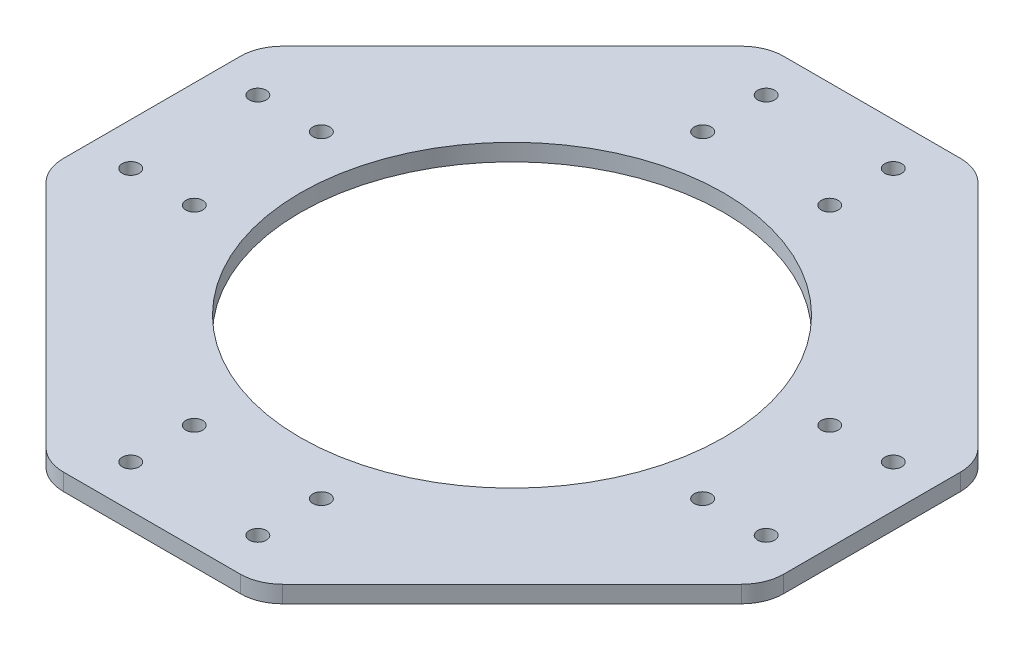
ISO-10303-21;
HEADER;
FILE_DESCRIPTION(('STEP AP214'),'2;1');
FILE_NAME('part.step','',(''),(''),'','','');
FILE_SCHEMA(('AUTOMOTIVE_DESIGN { 1 0 10303 214 1 1 1 1 }'));
ENDSEC;
DATA;
#1=APPLICATION_CONTEXT('core data for automotive mechanical design processes');
#2=APPLICATION_PROTOCOL_DEFINITION('international standard','automotive_design',2000,#1);
#3=PRODUCT_CONTEXT('',#1,'mechanical');
#4=PRODUCT('Part','Part','',(#3));
#5=PRODUCT_RELATED_PRODUCT_CATEGORY('part','',(#4));
#6=PRODUCT_DEFINITION_FORMATION('','',#4);
#7=PRODUCT_DEFINITION_CONTEXT('part definition',#1,'design');
#8=PRODUCT_DEFINITION('design','',#6,#7);
#9=PRODUCT_DEFINITION_SHAPE('','',#8);
#10=(LENGTH_UNIT() NAMED_UNIT(*) SI_UNIT(.MILLI.,.METRE.));
#11=(NAMED_UNIT(*) PLANE_ANGLE_UNIT() SI_UNIT($,.RADIAN.));
#12=(NAMED_UNIT(*) SI_UNIT($,.STERADIAN.) SOLID_ANGLE_UNIT());
#13=UNCERTAINTY_MEASURE_WITH_UNIT(LENGTH_MEASURE(1.E-05),#10,'distance_accuracy_value','');
#14=(GEOMETRIC_REPRESENTATION_CONTEXT(3) GLOBAL_UNCERTAINTY_ASSIGNED_CONTEXT((#13)) GLOBAL_UNIT_ASSIGNED_CONTEXT((#10,
#11,#12)) REPRESENTATION_CONTEXT('',''));
#15=CARTESIAN_POINT('',(0.,0.,0.));
#16=DIRECTION('',(0.,0.,1.));
#17=DIRECTION('',(1.,0.,0.));
#18=AXIS2_PLACEMENT_3D('',#15,#16,#17);
#19=CARTESIAN_POINT('',(0.,4.,85.0000000000001));
#20=DIRECTION('',(0.,0.,-1.));
#21=DIRECTION('',(-1.,0.,0.));
#22=AXIS2_PLACEMENT_3D('',#19,#20,#21);
#23=PLANE('',#22);
#24=DIRECTION('',(1.,0.,0.));
#25=VECTOR('',#24,1.);
#26=CARTESIAN_POINT('',(0.,0.,85.0000000000001));
#27=LINE('',#26,#25);
#28=CARTESIAN_POINT('',(-20.8578643762685,0.,85.0000000000001));
#29=VERTEX_POINT('',#28);
#30=CARTESIAN_POINT('',(20.8578643762685,0.,85.0000000000001));
#31=VERTEX_POINT('',#30);
#32=EDGE_CURVE('E165',#29,#31,#27,.T.);
#33=ORIENTED_EDGE('',*,*,#32,.T.);
#34=DIRECTION('',(0.,-1.,0.));
#35=VECTOR('',#34,1.);
#36=CARTESIAN_POINT('',(20.8578643762685,4.,85.0000000000001));
#37=LINE('',#36,#35);
#38=CARTESIAN_POINT('',(20.8578643762685,4.,85.0000000000001));
#39=VERTEX_POINT('',#38);
#40=EDGE_CURVE('E11',#31,#39,#37,.F.);
#41=ORIENTED_EDGE('',*,*,#40,.T.);
#42=DIRECTION('',(1.,0.,0.));
#43=VECTOR('',#42,1.);
#44=CARTESIAN_POINT('',(0.,4.,85.0000000000001));
#45=LINE('',#44,#43);
#46=CARTESIAN_POINT('',(-20.8578643762685,4.,85.0000000000001));
#47=VERTEX_POINT('',#46);
#48=EDGE_CURVE('E253',#47,#39,#45,.T.);
#49=ORIENTED_EDGE('',*,*,#48,.F.);
#50=DIRECTION('',(0.,-1.,0.));
#51=VECTOR('',#50,1.);
#52=CARTESIAN_POINT('',(-20.8578643762685,0.,85.0000000000001));
#53=LINE('',#52,#51);
#54=EDGE_CURVE('E49',#47,#29,#53,.T.);
#55=ORIENTED_EDGE('',*,*,#54,.T.);
#56=EDGE_LOOP('',(#33,#41,#49,#55));
#57=FACE_BOUND('',#56,.T.);
#58=ADVANCED_FACE('F45',(#57),#23,.F.);
#59=CARTESIAN_POINT('',(54.9999999999997,4.,55.0000000000001));
#60=DIRECTION('',(-0.707106781186544,0.,-0.707106781186551));
#61=DIRECTION('',(-0.707106781186551,0.,0.707106781186544));
#62=AXIS2_PLACEMENT_3D('',#59,#60,#61);
#63=PLANE('',#62);
#64=DIRECTION('',(0.707106781186551,0.,-0.707106781186544));
#65=VECTOR('',#64,1.);
#66=CARTESIAN_POINT('',(54.9999999999997,0.,55.0000000000001));
#67=LINE('',#66,#65);
#68=CARTESIAN_POINT('',(27.928932188134,0.,82.0710678118656));
#69=VERTEX_POINT('',#68);
#70=CARTESIAN_POINT('',(82.0710678118655,0.,27.9289321881345));
#71=VERTEX_POINT('',#70);
#72=EDGE_CURVE('E330',#69,#71,#67,.T.);
#73=ORIENTED_EDGE('',*,*,#72,.T.);
#74=DIRECTION('',(0.,-1.,0.));
#75=VECTOR('',#74,1.);
#76=CARTESIAN_POINT('',(82.0710678118655,4.,27.9289321881345));
#77=LINE('',#76,#75);
#78=CARTESIAN_POINT('',(82.0710678118655,4.,27.9289321881345));
#79=VERTEX_POINT('',#78);
#80=EDGE_CURVE('E246',#71,#79,#77,.F.);
#81=ORIENTED_EDGE('',*,*,#80,.T.);
#82=DIRECTION('',(0.707106781186551,0.,-0.707106781186544));
#83=VECTOR('',#82,1.);
#84=CARTESIAN_POINT('',(54.9999999999997,4.,55.0000000000001));
#85=LINE('',#84,#83);
#86=CARTESIAN_POINT('',(27.928932188134,4.,82.0710678118656));
#87=VERTEX_POINT('',#86);
#88=EDGE_CURVE('E251',#87,#79,#85,.T.);
#89=ORIENTED_EDGE('',*,*,#88,.F.);
#90=DIRECTION('',(0.,-1.,0.));
#91=VECTOR('',#90,1.);
#92=CARTESIAN_POINT('',(27.928932188134,4.,82.0710678118656));
#93=LINE('',#92,#91);
#94=EDGE_CURVE('E245',#87,#69,#93,.T.);
#95=ORIENTED_EDGE('',*,*,#94,.T.);
#96=EDGE_LOOP('',(#73,#81,#89,#95));
#97=FACE_BOUND('',#96,.T.);
#98=ADVANCED_FACE('F419',(#97),#63,.F.);
#99=CARTESIAN_POINT('',(85.0000000000001,4.,0.));
#100=DIRECTION('',(1.,0.,0.));
#101=DIRECTION('',(0.,0.,-1.));
#102=AXIS2_PLACEMENT_3D('',#99,#100,#101);
#103=PLANE('',#102);
#104=DIRECTION('',(0.,0.,1.));
#105=VECTOR('',#104,1.);
#106=CARTESIAN_POINT('',(85.0000000000001,0.,0.));
#107=LINE('',#106,#105);
#108=CARTESIAN_POINT('',(85.0000000000001,0.,-20.8578643762691));
#109=VERTEX_POINT('',#108);
#110=CARTESIAN_POINT('',(85.0000000000001,0.,20.857864376269));
#111=VERTEX_POINT('',#110);
#112=EDGE_CURVE('E329',#109,#111,#107,.T.);
#113=ORIENTED_EDGE('',*,*,#112,.F.);
#114=DIRECTION('',(0.,-1.,0.));
#115=VECTOR('',#114,1.);
#116=CARTESIAN_POINT('',(85.0000000000001,4.,-20.8578643762691));
#117=LINE('',#116,#115);
#118=CARTESIAN_POINT('',(85.0000000000001,4.,-20.8578643762691));
#119=VERTEX_POINT('',#118);
#120=EDGE_CURVE('E242',#109,#119,#117,.F.);
#121=ORIENTED_EDGE('',*,*,#120,.T.);
#122=DIRECTION('',(0.,0.,1.));
#123=VECTOR('',#122,1.);
#124=CARTESIAN_POINT('',(85.0000000000001,4.,0.));
#125=LINE('',#124,#123);
#126=CARTESIAN_POINT('',(85.0000000000001,4.,20.857864376269));
#127=VERTEX_POINT('',#126);
#128=EDGE_CURVE('E260',#119,#127,#125,.T.);
#129=ORIENTED_EDGE('',*,*,#128,.T.);
#130=DIRECTION('',(0.,-1.,0.));
#131=VECTOR('',#130,1.);
#132=CARTESIAN_POINT('',(85.0000000000001,0.,20.857864376269));
#133=LINE('',#132,#131);
#134=EDGE_CURVE('E236',#127,#111,#133,.T.);
#135=ORIENTED_EDGE('',*,*,#134,.T.);
#136=EDGE_LOOP('',(#113,#121,#129,#135));
#137=FACE_BOUND('',#136,.T.);
#138=ADVANCED_FACE('F422',(#137),#103,.T.);
#139=CARTESIAN_POINT('',(54.9999999999997,4.,-55.0000000000002));
#140=DIRECTION('',(0.707106781186544,0.,-0.707106781186551));
#141=DIRECTION('',(-0.707106781186551,0.,-0.707106781186544));
#142=AXIS2_PLACEMENT_3D('',#139,#140,#141);
#143=PLANE('',#142);
#144=DIRECTION('',(0.707106781186551,0.,0.707106781186544));
#145=VECTOR('',#144,1.);
#146=CARTESIAN_POINT('',(54.9999999999997,0.,-55.0000000000002));
#147=LINE('',#146,#145);
#148=CARTESIAN_POINT('',(27.928932188134,0.,-82.0710678118656));
#149=VERTEX_POINT('',#148);
#150=CARTESIAN_POINT('',(82.0710678118655,0.,-27.9289321881346));
#151=VERTEX_POINT('',#150);
#152=EDGE_CURVE('E334',#149,#151,#147,.T.);
#153=ORIENTED_EDGE('',*,*,#152,.F.);
#154=DIRECTION('',(0.,-1.,0.));
#155=VECTOR('',#154,1.);
#156=CARTESIAN_POINT('',(27.928932188134,4.,-82.0710678118656));
#157=LINE('',#156,#155);
#158=CARTESIAN_POINT('',(27.928932188134,4.,-82.0710678118656));
#159=VERTEX_POINT('',#158);
#160=EDGE_CURVE('E237',#149,#159,#157,.F.);
#161=ORIENTED_EDGE('',*,*,#160,.T.);
#162=DIRECTION('',(0.707106781186551,0.,0.707106781186544));
#163=VECTOR('',#162,1.);
#164=CARTESIAN_POINT('',(54.9999999999997,4.,-55.0000000000002));
#165=LINE('',#164,#163);
#166=CARTESIAN_POINT('',(82.0710678118655,4.,-27.9289321881346));
#167=VERTEX_POINT('',#166);
#168=EDGE_CURVE('E266',#159,#167,#165,.T.);
#169=ORIENTED_EDGE('',*,*,#168,.T.);
#170=DIRECTION('',(0.,-1.,0.));
#171=VECTOR('',#170,1.);
#172=CARTESIAN_POINT('',(82.0710678118655,4.,-27.9289321881346));
#173=LINE('',#172,#171);
#174=EDGE_CURVE('E234',#167,#151,#173,.T.);
#175=ORIENTED_EDGE('',*,*,#174,.T.);
#176=EDGE_LOOP('',(#153,#161,#169,#175));
#177=FACE_BOUND('',#176,.T.);
#178=ADVANCED_FACE('F526',(#177),#143,.T.);
#179=CARTESIAN_POINT('',(0.,4.,-85.0000000000001));
#180=DIRECTION('',(0.,0.,-1.));
#181=DIRECTION('',(-1.,0.,0.));
#182=AXIS2_PLACEMENT_3D('',#179,#180,#181);
#183=PLANE('',#182);
#184=DIRECTION('',(1.,0.,0.));
#185=VECTOR('',#184,1.);
#186=CARTESIAN_POINT('',(0.,0.,-85.0000000000001));
#187=LINE('',#186,#185);
#188=CARTESIAN_POINT('',(-20.8578643762685,0.,-85.0000000000001));
#189=VERTEX_POINT('',#188);
#190=CARTESIAN_POINT('',(20.8578643762685,0.,-85.0000000000001));
#191=VERTEX_POINT('',#190);
#192=EDGE_CURVE('E337',#189,#191,#187,.T.);
#193=ORIENTED_EDGE('',*,*,#192,.F.);
#194=DIRECTION('',(0.,-1.,0.));
#195=VECTOR('',#194,1.);
#196=CARTESIAN_POINT('',(-20.8578643762685,4.,-85.0000000000001));
#197=LINE('',#196,#195);
#198=CARTESIAN_POINT('',(-20.8578643762685,4.,-85.0000000000001));
#199=VERTEX_POINT('',#198);
#200=EDGE_CURVE('E231',#189,#199,#197,.F.);
#201=ORIENTED_EDGE('',*,*,#200,.T.);
#202=DIRECTION('',(1.,0.,0.));
#203=VECTOR('',#202,1.);
#204=CARTESIAN_POINT('',(0.,4.,-85.0000000000001));
#205=LINE('',#204,#203);
#206=CARTESIAN_POINT('',(20.8578643762685,4.,-85.0000000000001));
#207=VERTEX_POINT('',#206);
#208=EDGE_CURVE('E267',#199,#207,#205,.T.);
#209=ORIENTED_EDGE('',*,*,#208,.T.);
#210=DIRECTION('',(0.,-1.,0.));
#211=VECTOR('',#210,1.);
#212=CARTESIAN_POINT('',(20.8578643762685,4.,-85.0000000000001));
#213=LINE('',#212,#211);
#214=EDGE_CURVE('E230',#207,#191,#213,.T.);
#215=ORIENTED_EDGE('',*,*,#214,.T.);
#216=EDGE_LOOP('',(#193,#201,#209,#215));
#217=FACE_BOUND('',#216,.T.);
#218=ADVANCED_FACE('F531',(#217),#183,.T.);
#219=CARTESIAN_POINT('',(-54.9999999999997,4.,-55.0000000000002));
#220=DIRECTION('',(0.707106781186544,0.,0.707106781186551));
#221=DIRECTION('',(0.707106781186551,0.,-0.707106781186544));
#222=AXIS2_PLACEMENT_3D('',#219,#220,#221);
#223=PLANE('',#222);
#224=DIRECTION('',(-0.707106781186551,0.,0.707106781186544));
#225=VECTOR('',#224,1.);
#226=CARTESIAN_POINT('',(-54.9999999999997,0.,-55.0000000000002));
#227=LINE('',#226,#225);
#228=CARTESIAN_POINT('',(-27.928932188134,0.,-82.0710678118656));
#229=VERTEX_POINT('',#228);
#230=CARTESIAN_POINT('',(-82.0710678118655,0.,-27.9289321881346));
#231=VERTEX_POINT('',#230);
#232=EDGE_CURVE('E336',#229,#231,#227,.T.);
#233=ORIENTED_EDGE('',*,*,#232,.T.);
#234=DIRECTION('',(0.,-1.,0.));
#235=VECTOR('',#234,1.);
#236=CARTESIAN_POINT('',(-82.0710678118655,4.,-27.9289321881346));
#237=LINE('',#236,#235);
#238=CARTESIAN_POINT('',(-82.0710678118655,4.,-27.9289321881346));
#239=VERTEX_POINT('',#238);
#240=EDGE_CURVE('E60',#231,#239,#237,.F.);
#241=ORIENTED_EDGE('',*,*,#240,.T.);
#242=DIRECTION('',(-0.707106781186551,0.,0.707106781186544));
#243=VECTOR('',#242,1.);
#244=CARTESIAN_POINT('',(-54.9999999999997,4.,-55.0000000000002));
#245=LINE('',#244,#243);
#246=CARTESIAN_POINT('',(-27.928932188134,4.,-82.0710678118656));
#247=VERTEX_POINT('',#246);
#248=EDGE_CURVE('E275',#247,#239,#245,.T.);
#249=ORIENTED_EDGE('',*,*,#248,.F.);
#250=DIRECTION('',(0.,-1.,0.));
#251=VECTOR('',#250,1.);
#252=CARTESIAN_POINT('',(-27.928932188134,0.,-82.0710678118656));
#253=LINE('',#252,#251);
#254=EDGE_CURVE('E221',#247,#229,#253,.T.);
#255=ORIENTED_EDGE('',*,*,#254,.T.);
#256=EDGE_LOOP('',(#233,#241,#249,#255));
#257=FACE_BOUND('',#256,.T.);
#258=ADVANCED_FACE('F540',(#257),#223,.F.);
#259=CARTESIAN_POINT('',(-85.0000000000001,4.,0.));
#260=DIRECTION('',(1.,0.,0.));
#261=DIRECTION('',(0.,0.,-1.));
#262=AXIS2_PLACEMENT_3D('',#259,#260,#261);
#263=PLANE('',#262);
#264=DIRECTION('',(0.,0.,1.));
#265=VECTOR('',#264,1.);
#266=CARTESIAN_POINT('',(-85.0000000000001,0.,0.));
#267=LINE('',#266,#265);
#268=CARTESIAN_POINT('',(-85.0000000000001,0.,-20.8578643762691));
#269=VERTEX_POINT('',#268);
#270=CARTESIAN_POINT('',(-85.0000000000001,0.,20.8578643762691));
#271=VERTEX_POINT('',#270);
#272=EDGE_CURVE('E179',#269,#271,#267,.T.);
#273=ORIENTED_EDGE('',*,*,#272,.T.);
#274=DIRECTION('',(0.,-1.,0.));
#275=VECTOR('',#274,1.);
#276=CARTESIAN_POINT('',(-85.0000000000001,4.,20.8578643762691));
#277=LINE('',#276,#275);
#278=CARTESIAN_POINT('',(-85.0000000000001,4.,20.8578643762691));
#279=VERTEX_POINT('',#278);
#280=EDGE_CURVE('E208',#271,#279,#277,.F.);
#281=ORIENTED_EDGE('',*,*,#280,.T.);
#282=DIRECTION('',(0.,0.,1.));
#283=VECTOR('',#282,1.);
#284=CARTESIAN_POINT('',(-85.0000000000001,4.,0.));
#285=LINE('',#284,#283);
#286=CARTESIAN_POINT('',(-85.0000000000001,4.,-20.8578643762691));
#287=VERTEX_POINT('',#286);
#288=EDGE_CURVE('E273',#287,#279,#285,.T.);
#289=ORIENTED_EDGE('',*,*,#288,.F.);
#290=DIRECTION('',(0.,-1.,0.));
#291=VECTOR('',#290,1.);
#292=CARTESIAN_POINT('',(-85.0000000000001,4.,-20.8578643762691));
#293=LINE('',#292,#291);
#294=EDGE_CURVE('E202',#287,#269,#293,.T.);
#295=ORIENTED_EDGE('',*,*,#294,.T.);
#296=EDGE_LOOP('',(#273,#281,#289,#295));
#297=FACE_BOUND('',#296,.T.);
#298=ADVANCED_FACE('F545',(#297),#263,.F.);
#299=CARTESIAN_POINT('',(75.0000000000001,4.,-15.));
#300=DIRECTION('',(0.,-1.,0.));
#301=DIRECTION('',(0.,0.,-1.));
#302=AXIS2_PLACEMENT_3D('',#299,#300,#301);
#303=CYLINDRICAL_SURFACE('',#302,2.);
#304=CARTESIAN_POINT('',(75.0000000000001,4.,-15.));
#305=DIRECTION('',(0.,1.,0.));
#306=DIRECTION('',(0.,0.,1.));
#307=AXIS2_PLACEMENT_3D('',#304,#305,#306);
#308=CIRCLE('',#307,2.);
#309=CARTESIAN_POINT('',(75.0000000000001,4.,-13.));
#310=VERTEX_POINT('',#309);
#311=EDGE_CURVE('E187',#310,#310,#308,.F.);
#312=ORIENTED_EDGE('',*,*,#311,.F.);
#313=EDGE_LOOP('',(#312));
#314=FACE_BOUND('',#313,.T.);
#315=CARTESIAN_POINT('',(75.0000000000001,0.,-15.));
#316=DIRECTION('',(0.,1.,0.));
#317=DIRECTION('',(0.,0.,1.));
#318=AXIS2_PLACEMENT_3D('',#315,#316,#317);
#319=CIRCLE('',#318,2.);
#320=CARTESIAN_POINT('',(75.0000000000001,0.,-13.));
#321=VERTEX_POINT('',#320);
#322=EDGE_CURVE('E177',#321,#321,#319,.F.);
#323=ORIENTED_EDGE('',*,*,#322,.T.);
#324=EDGE_LOOP('',(#323));
#325=FACE_BOUND('',#324,.T.);
#326=ADVANCED_FACE('F544',(#314,#325),#303,.F.);
#327=CARTESIAN_POINT('',(-54.9999999999996,4.,55.0000000000002));
#328=DIRECTION('',(-0.707106781186544,0.,0.707106781186551));
#329=DIRECTION('',(0.707106781186551,0.,0.707106781186544));
#330=AXIS2_PLACEMENT_3D('',#327,#328,#329);
#331=PLANE('',#330);
#332=DIRECTION('',(-0.707106781186551,0.,-0.707106781186544));
#333=VECTOR('',#332,1.);
#334=CARTESIAN_POINT('',(-54.9999999999996,4.,55.0000000000002));
#335=LINE('',#334,#333);
#336=CARTESIAN_POINT('',(-27.9289321881339,4.,82.0710678118656));
#337=VERTEX_POINT('',#336);
#338=CARTESIAN_POINT('',(-82.0710678118655,4.,27.9289321881346));
#339=VERTEX_POINT('',#338);
#340=EDGE_CURVE('E280',#337,#339,#335,.T.);
#341=ORIENTED_EDGE('',*,*,#340,.T.);
#342=DIRECTION('',(0.,-1.,0.));
#343=VECTOR('',#342,1.);
#344=CARTESIAN_POINT('',(-82.0710678118655,0.,27.9289321881346));
#345=LINE('',#344,#343);
#346=CARTESIAN_POINT('',(-82.0710678118655,0.,27.9289321881346));
#347=VERTEX_POINT('',#346);
#348=EDGE_CURVE('E169',#339,#347,#345,.T.);
#349=ORIENTED_EDGE('',*,*,#348,.T.);
#350=DIRECTION('',(-0.707106781186551,0.,-0.707106781186544));
#351=VECTOR('',#350,1.);
#352=CARTESIAN_POINT('',(-54.9999999999996,0.,55.0000000000002));
#353=LINE('',#352,#351);
#354=CARTESIAN_POINT('',(-27.9289321881339,0.,82.0710678118656));
#355=VERTEX_POINT('',#354);
#356=EDGE_CURVE('E159',#355,#347,#353,.T.);
#357=ORIENTED_EDGE('',*,*,#356,.F.);
#358=DIRECTION('',(0.,-1.,0.));
#359=VECTOR('',#358,1.);
#360=CARTESIAN_POINT('',(-27.9289321881339,4.,82.0710678118656));
#361=LINE('',#360,#359);
#362=EDGE_CURVE('E171',#355,#337,#361,.F.);
#363=ORIENTED_EDGE('',*,*,#362,.T.);
#364=EDGE_LOOP('',(#341,#349,#357,#363));
#365=FACE_BOUND('',#364,.T.);
#366=ADVANCED_FACE('F175',(#365),#331,.T.);
#367=CARTESIAN_POINT('',(-15.,4.,-75.0000000000001));
#368=DIRECTION('',(0.,-1.,0.));
#369=DIRECTION('',(0.,0.,-1.));
#370=AXIS2_PLACEMENT_3D('',#367,#368,#369);
#371=CYLINDRICAL_SURFACE('',#370,2.);
#372=CARTESIAN_POINT('',(-15.,4.,-75.0000000000001));
#373=DIRECTION('',(0.,1.,0.));
#374=DIRECTION('',(0.,0.,1.));
#375=AXIS2_PLACEMENT_3D('',#372,#373,#374);
#376=CIRCLE('',#375,2.);
#377=CARTESIAN_POINT('',(-15.,4.,-73.0000000000001));
#378=VERTEX_POINT('',#377);
#379=EDGE_CURVE('E255',#378,#378,#376,.T.);
#380=ORIENTED_EDGE('',*,*,#379,.T.);
#381=EDGE_LOOP('',(#380));
#382=FACE_BOUND('',#381,.T.);
#383=CARTESIAN_POINT('',(-15.,0.,-75.0000000000001));
#384=DIRECTION('',(0.,1.,0.));
#385=DIRECTION('',(0.,0.,1.));
#386=AXIS2_PLACEMENT_3D('',#383,#384,#385);
#387=CIRCLE('',#386,2.);
#388=CARTESIAN_POINT('',(-15.,0.,-73.0000000000001));
#389=VERTEX_POINT('',#388);
#390=EDGE_CURVE('E323',#389,#389,#387,.T.);
#391=ORIENTED_EDGE('',*,*,#390,.F.);
#392=EDGE_LOOP('',(#391));
#393=FACE_BOUND('',#392,.T.);
#394=ADVANCED_FACE('F429',(#382,#393),#371,.F.);
#395=CARTESIAN_POINT('',(15.,4.,-75.0000000000001));
#396=DIRECTION('',(0.,-1.,0.));
#397=DIRECTION('',(0.,0.,-1.));
#398=AXIS2_PLACEMENT_3D('',#395,#396,#397);
#399=CYLINDRICAL_SURFACE('',#398,2.);
#400=CARTESIAN_POINT('',(15.,4.,-75.0000000000001));
#401=DIRECTION('',(0.,1.,0.));
#402=DIRECTION('',(0.,0.,1.));
#403=AXIS2_PLACEMENT_3D('',#400,#401,#402);
#404=CIRCLE('',#403,2.);
#405=CARTESIAN_POINT('',(15.,4.,-73.0000000000001));
#406=VERTEX_POINT('',#405);
#407=EDGE_CURVE('E257',#406,#406,#404,.T.);
#408=ORIENTED_EDGE('',*,*,#407,.T.);
#409=EDGE_LOOP('',(#408));
#410=FACE_BOUND('',#409,.T.);
#411=CARTESIAN_POINT('',(15.,0.,-75.0000000000001));
#412=DIRECTION('',(0.,1.,0.));
#413=DIRECTION('',(0.,0.,1.));
#414=AXIS2_PLACEMENT_3D('',#411,#412,#413);
#415=CIRCLE('',#414,2.);
#416=CARTESIAN_POINT('',(15.,0.,-73.0000000000001));
#417=VERTEX_POINT('',#416);
#418=EDGE_CURVE('E319',#417,#417,#415,.T.);
#419=ORIENTED_EDGE('',*,*,#418,.F.);
#420=EDGE_LOOP('',(#419));
#421=FACE_BOUND('',#420,.T.);
#422=ADVANCED_FACE('F394',(#410,#421),#399,.F.);
#423=CARTESIAN_POINT('',(0.,4.,0.));
#424=DIRECTION('',(0.,-1.,0.));
#425=DIRECTION('',(0.,0.,-1.));
#426=AXIS2_PLACEMENT_3D('',#423,#424,#425);
#427=CYLINDRICAL_SURFACE('',#426,50.);
#428=CARTESIAN_POINT('',(0.,4.,0.));
#429=DIRECTION('',(0.,1.,0.));
#430=DIRECTION('',(0.,0.,1.));
#431=AXIS2_PLACEMENT_3D('',#428,#429,#430);
#432=CIRCLE('',#431,50.);
#433=CARTESIAN_POINT('',(0.,4.,50.));
#434=VERTEX_POINT('',#433);
#435=EDGE_CURVE('E390',#434,#434,#432,.T.);
#436=ORIENTED_EDGE('',*,*,#435,.T.);
#437=EDGE_LOOP('',(#436));
#438=FACE_BOUND('',#437,.T.);
#439=CARTESIAN_POINT('',(0.,0.,0.));
#440=DIRECTION('',(0.,1.,0.));
#441=DIRECTION('',(0.,0.,1.));
#442=AXIS2_PLACEMENT_3D('',#439,#440,#441);
#443=CIRCLE('',#442,50.);
#444=CARTESIAN_POINT('',(0.,0.,50.));
#445=VERTEX_POINT('',#444);
#446=EDGE_CURVE('E320',#445,#445,#443,.T.);
#447=ORIENTED_EDGE('',*,*,#446,.F.);
#448=EDGE_LOOP('',(#447));
#449=FACE_BOUND('',#448,.T.);
#450=ADVANCED_FACE('F436',(#438,#449),#427,.F.);
#451=CARTESIAN_POINT('',(-75.0000000000001,4.,-15.));
#452=DIRECTION('',(0.,-1.,0.));
#453=DIRECTION('',(0.,0.,-1.));
#454=AXIS2_PLACEMENT_3D('',#451,#452,#453);
#455=CYLINDRICAL_SURFACE('',#454,2.);
#456=CARTESIAN_POINT('',(-75.0000000000001,4.,-15.));
#457=DIRECTION('',(0.,1.,0.));
#458=DIRECTION('',(0.,0.,1.));
#459=AXIS2_PLACEMENT_3D('',#456,#457,#458);
#460=CIRCLE('',#459,2.);
#461=CARTESIAN_POINT('',(-75.0000000000001,4.,-13.));
#462=VERTEX_POINT('',#461);
#463=EDGE_CURVE('E383',#462,#462,#460,.T.);
#464=ORIENTED_EDGE('',*,*,#463,.T.);
#465=EDGE_LOOP('',(#464));
#466=FACE_BOUND('',#465,.T.);
#467=CARTESIAN_POINT('',(-75.0000000000001,0.,-15.));
#468=DIRECTION('',(0.,1.,0.));
#469=DIRECTION('',(0.,0.,1.));
#470=AXIS2_PLACEMENT_3D('',#467,#468,#469);
#471=CIRCLE('',#470,2.);
#472=CARTESIAN_POINT('',(-75.0000000000001,0.,-13.));
#473=VERTEX_POINT('',#472);
#474=EDGE_CURVE('E314',#473,#473,#471,.T.);
#475=ORIENTED_EDGE('',*,*,#474,.F.);
#476=EDGE_LOOP('',(#475));
#477=FACE_BOUND('',#476,.T.);
#478=ADVANCED_FACE('F438',(#466,#477),#455,.F.);
#479=CARTESIAN_POINT('',(-75.0000000000001,4.,15.));
#480=DIRECTION('',(0.,-1.,0.));
#481=DIRECTION('',(0.,0.,-1.));
#482=AXIS2_PLACEMENT_3D('',#479,#480,#481);
#483=CYLINDRICAL_SURFACE('',#482,2.);
#484=CARTESIAN_POINT('',(-75.0000000000001,4.,15.));
#485=DIRECTION('',(0.,1.,0.));
#486=DIRECTION('',(0.,0.,1.));
#487=AXIS2_PLACEMENT_3D('',#484,#485,#486);
#488=CIRCLE('',#487,2.);
#489=CARTESIAN_POINT('',(-75.0000000000001,4.,17.));
#490=VERTEX_POINT('',#489);
#491=EDGE_CURVE('E381',#490,#490,#488,.T.);
#492=ORIENTED_EDGE('',*,*,#491,.T.);
#493=EDGE_LOOP('',(#492));
#494=FACE_BOUND('',#493,.T.);
#495=CARTESIAN_POINT('',(-75.0000000000001,0.,15.));
#496=DIRECTION('',(0.,1.,0.));
#497=DIRECTION('',(0.,0.,1.));
#498=AXIS2_PLACEMENT_3D('',#495,#496,#497);
#499=CIRCLE('',#498,2.);
#500=CARTESIAN_POINT('',(-75.0000000000001,0.,17.));
#501=VERTEX_POINT('',#500);
#502=EDGE_CURVE('E313',#501,#501,#499,.T.);
#503=ORIENTED_EDGE('',*,*,#502,.F.);
#504=EDGE_LOOP('',(#503));
#505=FACE_BOUND('',#504,.T.);
#506=ADVANCED_FACE('F444',(#494,#505),#483,.F.);
#507=CARTESIAN_POINT('',(75.0000000000001,4.,15.));
#508=DIRECTION('',(0.,-1.,0.));
#509=DIRECTION('',(0.,0.,-1.));
#510=AXIS2_PLACEMENT_3D('',#507,#508,#509);
#511=CYLINDRICAL_SURFACE('',#510,2.);
#512=CARTESIAN_POINT('',(75.0000000000001,4.,15.));
#513=DIRECTION('',(0.,1.,0.));
#514=DIRECTION('',(0.,0.,1.));
#515=AXIS2_PLACEMENT_3D('',#512,#513,#514);
#516=CIRCLE('',#515,2.);
#517=CARTESIAN_POINT('',(75.0000000000001,4.,17.));
#518=VERTEX_POINT('',#517);
#519=EDGE_CURVE('E378',#518,#518,#516,.F.);
#520=ORIENTED_EDGE('',*,*,#519,.F.);
#521=EDGE_LOOP('',(#520));
#522=FACE_BOUND('',#521,.T.);
#523=CARTESIAN_POINT('',(75.0000000000001,0.,15.));
#524=DIRECTION('',(0.,1.,0.));
#525=DIRECTION('',(0.,0.,1.));
#526=AXIS2_PLACEMENT_3D('',#523,#524,#525);
#527=CIRCLE('',#526,2.);
#528=CARTESIAN_POINT('',(75.0000000000001,0.,17.));
#529=VERTEX_POINT('',#528);
#530=EDGE_CURVE('E306',#529,#529,#527,.F.);
#531=ORIENTED_EDGE('',*,*,#530,.T.);
#532=EDGE_LOOP('',(#531));
#533=FACE_BOUND('',#532,.T.);
#534=ADVANCED_FACE('F449',(#522,#533),#511,.F.);
#535=CARTESIAN_POINT('',(15.,4.,75.0000000000001));
#536=DIRECTION('',(0.,-1.,0.));
#537=DIRECTION('',(0.,0.,-1.));
#538=AXIS2_PLACEMENT_3D('',#535,#536,#537);
#539=CYLINDRICAL_SURFACE('',#538,2.00000000000001);
#540=CARTESIAN_POINT('',(15.,4.,75.0000000000001));
#541=DIRECTION('',(0.,1.,0.));
#542=DIRECTION('',(0.,0.,1.));
#543=AXIS2_PLACEMENT_3D('',#540,#541,#542);
#544=CIRCLE('',#543,2.00000000000001);
#545=CARTESIAN_POINT('',(15.,4.,77.0000000000001));
#546=VERTEX_POINT('',#545);
#547=EDGE_CURVE('E374',#546,#546,#544,.F.);
#548=ORIENTED_EDGE('',*,*,#547,.F.);
#549=EDGE_LOOP('',(#548));
#550=FACE_BOUND('',#549,.T.);
#551=CARTESIAN_POINT('',(15.,0.,75.0000000000001));
#552=DIRECTION('',(0.,1.,0.));
#553=DIRECTION('',(0.,0.,1.));
#554=AXIS2_PLACEMENT_3D('',#551,#552,#553);
#555=CIRCLE('',#554,2.00000000000001);
#556=CARTESIAN_POINT('',(15.,0.,77.0000000000001));
#557=VERTEX_POINT('',#556);
#558=EDGE_CURVE('E305',#557,#557,#555,.F.);
#559=ORIENTED_EDGE('',*,*,#558,.T.);
#560=EDGE_LOOP('',(#559));
#561=FACE_BOUND('',#560,.T.);
#562=ADVANCED_FACE('F451',(#550,#561),#539,.F.);
#563=CARTESIAN_POINT('',(-15.,4.,-60.));
#564=DIRECTION('',(0.,-1.,0.));
#565=DIRECTION('',(0.,0.,-1.));
#566=AXIS2_PLACEMENT_3D('',#563,#564,#565);
#567=CYLINDRICAL_SURFACE('',#566,2.);
#568=CARTESIAN_POINT('',(-15.,4.,-60.));
#569=DIRECTION('',(0.,1.,0.));
#570=DIRECTION('',(0.,0.,1.));
#571=AXIS2_PLACEMENT_3D('',#568,#569,#570);
#572=CIRCLE('',#571,2.);
#573=CARTESIAN_POINT('',(-15.,4.,-58.));
#574=VERTEX_POINT('',#573);
#575=EDGE_CURVE('E375',#574,#574,#572,.T.);
#576=ORIENTED_EDGE('',*,*,#575,.T.);
#577=EDGE_LOOP('',(#576));
#578=FACE_BOUND('',#577,.T.);
#579=CARTESIAN_POINT('',(-15.,0.,-60.));
#580=DIRECTION('',(0.,1.,0.));
#581=DIRECTION('',(0.,0.,1.));
#582=AXIS2_PLACEMENT_3D('',#579,#580,#581);
#583=CIRCLE('',#582,2.);
#584=CARTESIAN_POINT('',(-15.,0.,-58.));
#585=VERTEX_POINT('',#584);
#586=EDGE_CURVE('E302',#585,#585,#583,.T.);
#587=ORIENTED_EDGE('',*,*,#586,.F.);
#588=EDGE_LOOP('',(#587));
#589=FACE_BOUND('',#588,.T.);
#590=ADVANCED_FACE('F455',(#578,#589),#567,.F.);
#591=CARTESIAN_POINT('',(15.,4.,-60.));
#592=DIRECTION('',(0.,-1.,0.));
#593=DIRECTION('',(0.,0.,-1.));
#594=AXIS2_PLACEMENT_3D('',#591,#592,#593);
#595=CYLINDRICAL_SURFACE('',#594,2.);
#596=CARTESIAN_POINT('',(15.,4.,-60.));
#597=DIRECTION('',(0.,1.,0.));
#598=DIRECTION('',(0.,0.,1.));
#599=AXIS2_PLACEMENT_3D('',#596,#597,#598);
#600=CIRCLE('',#599,2.);
#601=CARTESIAN_POINT('',(15.,4.,-58.));
#602=VERTEX_POINT('',#601);
#603=EDGE_CURVE('E369',#602,#602,#600,.T.);
#604=ORIENTED_EDGE('',*,*,#603,.T.);
#605=EDGE_LOOP('',(#604));
#606=FACE_BOUND('',#605,.T.);
#607=CARTESIAN_POINT('',(15.,0.,-60.));
#608=DIRECTION('',(0.,1.,0.));
#609=DIRECTION('',(0.,0.,1.));
#610=AXIS2_PLACEMENT_3D('',#607,#608,#609);
#611=CIRCLE('',#610,2.);
#612=CARTESIAN_POINT('',(15.,0.,-58.));
#613=VERTEX_POINT('',#612);
#614=EDGE_CURVE('E296',#613,#613,#611,.T.);
#615=ORIENTED_EDGE('',*,*,#614,.F.);
#616=EDGE_LOOP('',(#615));
#617=FACE_BOUND('',#616,.T.);
#618=ADVANCED_FACE('F459',(#606,#617),#595,.F.);
#619=CARTESIAN_POINT('',(60.,4.,-15.));
#620=DIRECTION('',(0.,-1.,0.));
#621=DIRECTION('',(0.,0.,-1.));
#622=AXIS2_PLACEMENT_3D('',#619,#620,#621);
#623=CYLINDRICAL_SURFACE('',#622,2.);
#624=CARTESIAN_POINT('',(60.,4.,-15.));
#625=DIRECTION('',(0.,1.,0.));
#626=DIRECTION('',(0.,0.,1.));
#627=AXIS2_PLACEMENT_3D('',#624,#625,#626);
#628=CIRCLE('',#627,2.);
#629=CARTESIAN_POINT('',(60.,4.,-13.));
#630=VERTEX_POINT('',#629);
#631=EDGE_CURVE('E368',#630,#630,#628,.T.);
#632=ORIENTED_EDGE('',*,*,#631,.T.);
#633=EDGE_LOOP('',(#632));
#634=FACE_BOUND('',#633,.T.);
#635=CARTESIAN_POINT('',(60.,0.,-15.));
#636=DIRECTION('',(0.,1.,0.));
#637=DIRECTION('',(0.,0.,1.));
#638=AXIS2_PLACEMENT_3D('',#635,#636,#637);
#639=CIRCLE('',#638,2.);
#640=CARTESIAN_POINT('',(60.,0.,-13.));
#641=VERTEX_POINT('',#640);
#642=EDGE_CURVE('E297',#641,#641,#639,.T.);
#643=ORIENTED_EDGE('',*,*,#642,.F.);
#644=EDGE_LOOP('',(#643));
#645=FACE_BOUND('',#644,.T.);
#646=ADVANCED_FACE('F465',(#634,#645),#623,.F.);
#647=CARTESIAN_POINT('',(60.,4.,15.));
#648=DIRECTION('',(0.,-1.,0.));
#649=DIRECTION('',(0.,0.,-1.));
#650=AXIS2_PLACEMENT_3D('',#647,#648,#649);
#651=CYLINDRICAL_SURFACE('',#650,2.);
#652=CARTESIAN_POINT('',(60.,4.,15.));
#653=DIRECTION('',(0.,1.,0.));
#654=DIRECTION('',(0.,0.,1.));
#655=AXIS2_PLACEMENT_3D('',#652,#653,#654);
#656=CIRCLE('',#655,2.);
#657=CARTESIAN_POINT('',(60.,4.,17.));
#658=VERTEX_POINT('',#657);
#659=EDGE_CURVE('E361',#658,#658,#656,.T.);
#660=ORIENTED_EDGE('',*,*,#659,.T.);
#661=EDGE_LOOP('',(#660));
#662=FACE_BOUND('',#661,.T.);
#663=CARTESIAN_POINT('',(60.,0.,15.));
#664=DIRECTION('',(0.,1.,0.));
#665=DIRECTION('',(0.,0.,1.));
#666=AXIS2_PLACEMENT_3D('',#663,#664,#665);
#667=CIRCLE('',#666,2.);
#668=CARTESIAN_POINT('',(60.,0.,17.));
#669=VERTEX_POINT('',#668);
#670=EDGE_CURVE('E291',#669,#669,#667,.T.);
#671=ORIENTED_EDGE('',*,*,#670,.F.);
#672=EDGE_LOOP('',(#671));
#673=FACE_BOUND('',#672,.T.);
#674=ADVANCED_FACE('F467',(#662,#673),#651,.F.);
#675=CARTESIAN_POINT('',(15.,4.,60.));
#676=DIRECTION('',(0.,-1.,0.));
#677=DIRECTION('',(0.,0.,-1.));
#678=AXIS2_PLACEMENT_3D('',#675,#676,#677);
#679=CYLINDRICAL_SURFACE('',#678,2.);
#680=CARTESIAN_POINT('',(15.,4.,60.));
#681=DIRECTION('',(0.,1.,0.));
#682=DIRECTION('',(0.,0.,1.));
#683=AXIS2_PLACEMENT_3D('',#680,#681,#682);
#684=CIRCLE('',#683,2.);
#685=CARTESIAN_POINT('',(15.,4.,62.));
#686=VERTEX_POINT('',#685);
#687=EDGE_CURVE('E360',#686,#686,#684,.T.);
#688=ORIENTED_EDGE('',*,*,#687,.T.);
#689=EDGE_LOOP('',(#688));
#690=FACE_BOUND('',#689,.T.);
#691=CARTESIAN_POINT('',(15.,0.,60.));
#692=DIRECTION('',(0.,1.,0.));
#693=DIRECTION('',(0.,0.,1.));
#694=AXIS2_PLACEMENT_3D('',#691,#692,#693);
#695=CIRCLE('',#694,2.);
#696=CARTESIAN_POINT('',(15.,0.,62.));
#697=VERTEX_POINT('',#696);
#698=EDGE_CURVE('E290',#697,#697,#695,.T.);
#699=ORIENTED_EDGE('',*,*,#698,.F.);
#700=EDGE_LOOP('',(#699));
#701=FACE_BOUND('',#700,.T.);
#702=ADVANCED_FACE('F473',(#690,#701),#679,.F.);
#703=CARTESIAN_POINT('',(-15.,4.,60.));
#704=DIRECTION('',(0.,-1.,0.));
#705=DIRECTION('',(0.,0.,-1.));
#706=AXIS2_PLACEMENT_3D('',#703,#704,#705);
#707=CYLINDRICAL_SURFACE('',#706,2.);
#708=CARTESIAN_POINT('',(-15.,4.,60.));
#709=DIRECTION('',(0.,1.,0.));
#710=DIRECTION('',(0.,0.,1.));
#711=AXIS2_PLACEMENT_3D('',#708,#709,#710);
#712=CIRCLE('',#711,2.);
#713=CARTESIAN_POINT('',(-15.,4.,62.));
#714=VERTEX_POINT('',#713);
#715=EDGE_CURVE('E353',#714,#714,#712,.T.);
#716=ORIENTED_EDGE('',*,*,#715,.T.);
#717=EDGE_LOOP('',(#716));
#718=FACE_BOUND('',#717,.T.);
#719=CARTESIAN_POINT('',(-15.,0.,60.));
#720=DIRECTION('',(0.,1.,0.));
#721=DIRECTION('',(0.,0.,1.));
#722=AXIS2_PLACEMENT_3D('',#719,#720,#721);
#723=CIRCLE('',#722,2.);
#724=CARTESIAN_POINT('',(-15.,0.,62.));
#725=VERTEX_POINT('',#724);
#726=EDGE_CURVE('E287',#725,#725,#723,.T.);
#727=ORIENTED_EDGE('',*,*,#726,.F.);
#728=EDGE_LOOP('',(#727));
#729=FACE_BOUND('',#728,.T.);
#730=ADVANCED_FACE('F474',(#718,#729),#707,.F.);
#731=CARTESIAN_POINT('',(-60.,4.,15.));
#732=DIRECTION('',(0.,-1.,0.));
#733=DIRECTION('',(0.,0.,-1.));
#734=AXIS2_PLACEMENT_3D('',#731,#732,#733);
#735=CYLINDRICAL_SURFACE('',#734,2.);
#736=CARTESIAN_POINT('',(-60.,4.,15.));
#737=DIRECTION('',(0.,1.,0.));
#738=DIRECTION('',(0.,0.,1.));
#739=AXIS2_PLACEMENT_3D('',#736,#737,#738);
#740=CIRCLE('',#739,2.);
#741=CARTESIAN_POINT('',(-60.,4.,17.));
#742=VERTEX_POINT('',#741);
#743=EDGE_CURVE('E348',#742,#742,#740,.T.);
#744=ORIENTED_EDGE('',*,*,#743,.T.);
#745=EDGE_LOOP('',(#744));
#746=FACE_BOUND('',#745,.T.);
#747=CARTESIAN_POINT('',(-60.,0.,15.));
#748=DIRECTION('',(0.,1.,0.));
#749=DIRECTION('',(0.,0.,1.));
#750=AXIS2_PLACEMENT_3D('',#747,#748,#749);
#751=CIRCLE('',#750,2.);
#752=CARTESIAN_POINT('',(-60.,0.,17.));
#753=VERTEX_POINT('',#752);
#754=EDGE_CURVE('E281',#753,#753,#751,.T.);
#755=ORIENTED_EDGE('',*,*,#754,.F.);
#756=EDGE_LOOP('',(#755));
#757=FACE_BOUND('',#756,.T.);
#758=ADVANCED_FACE('F418',(#746,#757),#735,.F.);
#759=CARTESIAN_POINT('',(-60.,4.,-15.));
#760=DIRECTION('',(0.,-1.,0.));
#761=DIRECTION('',(0.,0.,-1.));
#762=AXIS2_PLACEMENT_3D('',#759,#760,#761);
#763=CYLINDRICAL_SURFACE('',#762,2.);
#764=CARTESIAN_POINT('',(-60.,4.,-15.));
#765=DIRECTION('',(0.,1.,0.));
#766=DIRECTION('',(0.,0.,1.));
#767=AXIS2_PLACEMENT_3D('',#764,#765,#766);
#768=CIRCLE('',#767,2.);
#769=CARTESIAN_POINT('',(-60.,4.,-13.));
#770=VERTEX_POINT('',#769);
#771=EDGE_CURVE('E347',#770,#770,#768,.T.);
#772=ORIENTED_EDGE('',*,*,#771,.T.);
#773=EDGE_LOOP('',(#772));
#774=FACE_BOUND('',#773,.T.);
#775=CARTESIAN_POINT('',(-60.,0.,-15.));
#776=DIRECTION('',(0.,1.,0.));
#777=DIRECTION('',(0.,0.,1.));
#778=AXIS2_PLACEMENT_3D('',#775,#776,#777);
#779=CIRCLE('',#778,2.);
#780=CARTESIAN_POINT('',(-60.,0.,-13.));
#781=VERTEX_POINT('',#780);
#782=EDGE_CURVE('E282',#781,#781,#779,.T.);
#783=ORIENTED_EDGE('',*,*,#782,.F.);
#784=EDGE_LOOP('',(#783));
#785=FACE_BOUND('',#784,.T.);
#786=ADVANCED_FACE('F408',(#774,#785),#763,.F.);
#787=CARTESIAN_POINT('',(-15.,4.,75.0000000000001));
#788=DIRECTION('',(0.,-1.,0.));
#789=DIRECTION('',(0.,0.,-1.));
#790=AXIS2_PLACEMENT_3D('',#787,#788,#789);
#791=CYLINDRICAL_SURFACE('',#790,2.);
#792=CARTESIAN_POINT('',(-15.,4.,75.0000000000001));
#793=DIRECTION('',(0.,1.,0.));
#794=DIRECTION('',(0.,0.,1.));
#795=AXIS2_PLACEMENT_3D('',#792,#793,#794);
#796=CIRCLE('',#795,2.);
#797=CARTESIAN_POINT('',(-15.,4.,77.0000000000001));
#798=VERTEX_POINT('',#797);
#799=EDGE_CURVE('E185',#798,#798,#796,.F.);
#800=ORIENTED_EDGE('',*,*,#799,.F.);
#801=EDGE_LOOP('',(#800));
#802=FACE_BOUND('',#801,.T.);
#803=CARTESIAN_POINT('',(-15.,0.,75.0000000000001));
#804=DIRECTION('',(0.,1.,0.));
#805=DIRECTION('',(0.,0.,1.));
#806=AXIS2_PLACEMENT_3D('',#803,#804,#805);
#807=CIRCLE('',#806,2.);
#808=CARTESIAN_POINT('',(-15.,0.,77.0000000000001));
#809=VERTEX_POINT('',#808);
#810=EDGE_CURVE('E186',#809,#809,#807,.F.);
#811=ORIENTED_EDGE('',*,*,#810,.T.);
#812=EDGE_LOOP('',(#811));
#813=FACE_BOUND('',#812,.T.);
#814=ADVANCED_FACE('F399',(#802,#813),#791,.F.);
#815=CARTESIAN_POINT('',(0.,4.,0.));
#816=DIRECTION('',(0.,1.,0.));
#817=DIRECTION('',(0.,0.,1.));
#818=AXIS2_PLACEMENT_3D('',#815,#816,#817);
#819=PLANE('',#818);
#820=ORIENTED_EDGE('',*,*,#771,.F.);
#821=EDGE_LOOP('',(#820));
#822=FACE_BOUND('',#821,.T.);
#823=ORIENTED_EDGE('',*,*,#743,.F.);
#824=EDGE_LOOP('',(#823));
#825=FACE_BOUND('',#824,.T.);
#826=ORIENTED_EDGE('',*,*,#715,.F.);
#827=EDGE_LOOP('',(#826));
#828=FACE_BOUND('',#827,.T.);
#829=ORIENTED_EDGE('',*,*,#687,.F.);
#830=EDGE_LOOP('',(#829));
#831=FACE_BOUND('',#830,.T.);
#832=ORIENTED_EDGE('',*,*,#659,.F.);
#833=EDGE_LOOP('',(#832));
#834=FACE_BOUND('',#833,.T.);
#835=ORIENTED_EDGE('',*,*,#631,.F.);
#836=EDGE_LOOP('',(#835));
#837=FACE_BOUND('',#836,.T.);
#838=ORIENTED_EDGE('',*,*,#603,.F.);
#839=EDGE_LOOP('',(#838));
#840=FACE_BOUND('',#839,.T.);
#841=ORIENTED_EDGE('',*,*,#575,.F.);
#842=EDGE_LOOP('',(#841));
#843=FACE_BOUND('',#842,.T.);
#844=ORIENTED_EDGE('',*,*,#547,.T.);
#845=EDGE_LOOP('',(#844));
#846=FACE_BOUND('',#845,.T.);
#847=ORIENTED_EDGE('',*,*,#519,.T.);
#848=EDGE_LOOP('',(#847));
#849=FACE_BOUND('',#848,.T.);
#850=ORIENTED_EDGE('',*,*,#491,.F.);
#851=EDGE_LOOP('',(#850));
#852=FACE_BOUND('',#851,.T.);
#853=ORIENTED_EDGE('',*,*,#463,.F.);
#854=EDGE_LOOP('',(#853));
#855=FACE_BOUND('',#854,.T.);
#856=ORIENTED_EDGE('',*,*,#435,.F.);
#857=EDGE_LOOP('',(#856));
#858=FACE_BOUND('',#857,.T.);
#859=ORIENTED_EDGE('',*,*,#407,.F.);
#860=EDGE_LOOP('',(#859));
#861=FACE_BOUND('',#860,.T.);
#862=ORIENTED_EDGE('',*,*,#379,.F.);
#863=EDGE_LOOP('',(#862));
#864=FACE_BOUND('',#863,.T.);
#865=ORIENTED_EDGE('',*,*,#288,.T.);
#866=CARTESIAN_POINT('',(-75.0000000000001,4.,20.8578643762691));
#867=DIRECTION('',(0.,1.,0.));
#868=DIRECTION('',(0.,0.,1.));
#869=AXIS2_PLACEMENT_3D('',#866,#867,#868);
#870=CIRCLE('',#869,10.);
#871=EDGE_CURVE('E225',#279,#339,#870,.T.);
#872=ORIENTED_EDGE('',*,*,#871,.T.);
#873=ORIENTED_EDGE('',*,*,#340,.F.);
#874=CARTESIAN_POINT('',(-20.8578643762685,4.,75.0000000000001));
#875=DIRECTION('',(0.,1.,0.));
#876=DIRECTION('',(0.,0.,1.));
#877=AXIS2_PLACEMENT_3D('',#874,#875,#876);
#878=CIRCLE('',#877,10.);
#879=EDGE_CURVE('E182',#337,#47,#878,.T.);
#880=ORIENTED_EDGE('',*,*,#879,.T.);
#881=ORIENTED_EDGE('',*,*,#48,.T.);
#882=CARTESIAN_POINT('',(20.8578643762685,4.,75.0000000000001));
#883=DIRECTION('',(0.,1.,0.));
#884=DIRECTION('',(0.,0.,1.));
#885=AXIS2_PLACEMENT_3D('',#882,#883,#884);
#886=CIRCLE('',#885,10.);
#887=EDGE_CURVE('E211',#39,#87,#886,.T.);
#888=ORIENTED_EDGE('',*,*,#887,.T.);
#889=ORIENTED_EDGE('',*,*,#88,.T.);
#890=CARTESIAN_POINT('',(75.0000000000001,4.,20.857864376269));
#891=DIRECTION('',(0.,1.,0.));
#892=DIRECTION('',(0.,0.,1.));
#893=AXIS2_PLACEMENT_3D('',#890,#891,#892);
#894=CIRCLE('',#893,10.);
#895=EDGE_CURVE('E213',#79,#127,#894,.T.);
#896=ORIENTED_EDGE('',*,*,#895,.T.);
#897=ORIENTED_EDGE('',*,*,#128,.F.);
#898=CARTESIAN_POINT('',(75.0000000000001,4.,-20.8578643762691));
#899=DIRECTION('',(0.,1.,0.));
#900=DIRECTION('',(0.,0.,1.));
#901=AXIS2_PLACEMENT_3D('',#898,#899,#900);
#902=CIRCLE('',#901,10.);
#903=EDGE_CURVE('E214',#119,#167,#902,.T.);
#904=ORIENTED_EDGE('',*,*,#903,.T.);
#905=ORIENTED_EDGE('',*,*,#168,.F.);
#906=CARTESIAN_POINT('',(20.8578643762685,4.,-75.0000000000001));
#907=DIRECTION('',(0.,1.,0.));
#908=DIRECTION('',(0.,0.,1.));
#909=AXIS2_PLACEMENT_3D('',#906,#907,#908);
#910=CIRCLE('',#909,10.);
#911=EDGE_CURVE('E220',#159,#207,#910,.T.);
#912=ORIENTED_EDGE('',*,*,#911,.T.);
#913=ORIENTED_EDGE('',*,*,#208,.F.);
#914=CARTESIAN_POINT('',(-20.8578643762685,4.,-75.0000000000001));
#915=DIRECTION('',(0.,1.,0.));
#916=DIRECTION('',(0.,0.,1.));
#917=AXIS2_PLACEMENT_3D('',#914,#915,#916);
#918=CIRCLE('',#917,10.);
#919=EDGE_CURVE('E61',#199,#247,#918,.T.);
#920=ORIENTED_EDGE('',*,*,#919,.T.);
#921=ORIENTED_EDGE('',*,*,#248,.T.);
#922=CARTESIAN_POINT('',(-75.0000000000001,4.,-20.8578643762691));
#923=DIRECTION('',(0.,1.,0.));
#924=DIRECTION('',(0.,0.,1.));
#925=AXIS2_PLACEMENT_3D('',#922,#923,#924);
#926=CIRCLE('',#925,10.);
#927=EDGE_CURVE('E219',#239,#287,#926,.T.);
#928=ORIENTED_EDGE('',*,*,#927,.T.);
#929=EDGE_LOOP('',(#865,#872,#873,#880,#881,#888,#889,#896,#897,#904,#905,#912,#913,#920,#921,#928));
#930=FACE_BOUND('',#929,.T.);
#931=ORIENTED_EDGE('',*,*,#311,.T.);
#932=EDGE_LOOP('',(#931));
#933=FACE_BOUND('',#932,.T.);
#934=ORIENTED_EDGE('',*,*,#799,.T.);
#935=EDGE_LOOP('',(#934));
#936=FACE_BOUND('',#935,.T.);
#937=ADVANCED_FACE('F393',(#822,#825,#828,#831,#834,#837,#840,#843,#846,#849,#852,#855,#858,
#861,#864,#930,#933,#936),#819,.T.);
#938=CARTESIAN_POINT('',(0.,0.,0.));
#939=DIRECTION('',(0.,1.,0.));
#940=DIRECTION('',(0.,0.,1.));
#941=AXIS2_PLACEMENT_3D('',#938,#939,#940);
#942=PLANE('',#941);
#943=ORIENTED_EDGE('',*,*,#782,.T.);
#944=EDGE_LOOP('',(#943));
#945=FACE_BOUND('',#944,.T.);
#946=ORIENTED_EDGE('',*,*,#754,.T.);
#947=EDGE_LOOP('',(#946));
#948=FACE_BOUND('',#947,.T.);
#949=ORIENTED_EDGE('',*,*,#726,.T.);
#950=EDGE_LOOP('',(#949));
#951=FACE_BOUND('',#950,.T.);
#952=ORIENTED_EDGE('',*,*,#698,.T.);
#953=EDGE_LOOP('',(#952));
#954=FACE_BOUND('',#953,.T.);
#955=ORIENTED_EDGE('',*,*,#670,.T.);
#956=EDGE_LOOP('',(#955));
#957=FACE_BOUND('',#956,.T.);
#958=ORIENTED_EDGE('',*,*,#642,.T.);
#959=EDGE_LOOP('',(#958));
#960=FACE_BOUND('',#959,.T.);
#961=ORIENTED_EDGE('',*,*,#614,.T.);
#962=EDGE_LOOP('',(#961));
#963=FACE_BOUND('',#962,.T.);
#964=ORIENTED_EDGE('',*,*,#586,.T.);
#965=EDGE_LOOP('',(#964));
#966=FACE_BOUND('',#965,.T.);
#967=ORIENTED_EDGE('',*,*,#558,.F.);
#968=EDGE_LOOP('',(#967));
#969=FACE_BOUND('',#968,.T.);
#970=ORIENTED_EDGE('',*,*,#530,.F.);
#971=EDGE_LOOP('',(#970));
#972=FACE_BOUND('',#971,.T.);
#973=ORIENTED_EDGE('',*,*,#502,.T.);
#974=EDGE_LOOP('',(#973));
#975=FACE_BOUND('',#974,.T.);
#976=ORIENTED_EDGE('',*,*,#474,.T.);
#977=EDGE_LOOP('',(#976));
#978=FACE_BOUND('',#977,.T.);
#979=ORIENTED_EDGE('',*,*,#446,.T.);
#980=EDGE_LOOP('',(#979));
#981=FACE_BOUND('',#980,.T.);
#982=ORIENTED_EDGE('',*,*,#418,.T.);
#983=EDGE_LOOP('',(#982));
#984=FACE_BOUND('',#983,.T.);
#985=ORIENTED_EDGE('',*,*,#390,.T.);
#986=EDGE_LOOP('',(#985));
#987=FACE_BOUND('',#986,.T.);
#988=ORIENTED_EDGE('',*,*,#356,.T.);
#989=CARTESIAN_POINT('',(-75.0000000000001,0.,20.8578643762691));
#990=DIRECTION('',(0.,1.,0.));
#991=DIRECTION('',(0.,0.,1.));
#992=AXIS2_PLACEMENT_3D('',#989,#990,#991);
#993=CIRCLE('',#992,10.);
#994=EDGE_CURVE('E201',#347,#271,#993,.F.);
#995=ORIENTED_EDGE('',*,*,#994,.T.);
#996=ORIENTED_EDGE('',*,*,#272,.F.);
#997=CARTESIAN_POINT('',(-75.0000000000001,0.,-20.8578643762691));
#998=DIRECTION('',(0.,1.,0.));
#999=DIRECTION('',(0.,0.,1.));
#1000=AXIS2_PLACEMENT_3D('',#997,#998,#999);
#1001=CIRCLE('',#1000,10.);
#1002=EDGE_CURVE('E203',#269,#231,#1001,.F.);
#1003=ORIENTED_EDGE('',*,*,#1002,.T.);
#1004=ORIENTED_EDGE('',*,*,#232,.F.);
#1005=CARTESIAN_POINT('',(-20.8578643762685,0.,-75.0000000000001));
#1006=DIRECTION('',(0.,1.,0.));
#1007=DIRECTION('',(0.,0.,1.));
#1008=AXIS2_PLACEMENT_3D('',#1005,#1006,#1007);
#1009=CIRCLE('',#1008,10.);
#1010=EDGE_CURVE('E200',#229,#189,#1009,.F.);
#1011=ORIENTED_EDGE('',*,*,#1010,.T.);
#1012=ORIENTED_EDGE('',*,*,#192,.T.);
#1013=CARTESIAN_POINT('',(20.8578643762685,0.,-75.0000000000001));
#1014=DIRECTION('',(0.,1.,0.));
#1015=DIRECTION('',(0.,0.,1.));
#1016=AXIS2_PLACEMENT_3D('',#1013,#1014,#1015);
#1017=CIRCLE('',#1016,10.);
#1018=EDGE_CURVE('E197',#191,#149,#1017,.F.);
#1019=ORIENTED_EDGE('',*,*,#1018,.T.);
#1020=ORIENTED_EDGE('',*,*,#152,.T.);
#1021=CARTESIAN_POINT('',(75.0000000000001,0.,-20.8578643762691));
#1022=DIRECTION('',(0.,1.,0.));
#1023=DIRECTION('',(0.,0.,1.));
#1024=AXIS2_PLACEMENT_3D('',#1021,#1022,#1023);
#1025=CIRCLE('',#1024,10.);
#1026=EDGE_CURVE('E195',#151,#109,#1025,.F.);
#1027=ORIENTED_EDGE('',*,*,#1026,.T.);
#1028=ORIENTED_EDGE('',*,*,#112,.T.);
#1029=CARTESIAN_POINT('',(75.0000000000001,0.,20.857864376269));
#1030=DIRECTION('',(0.,1.,0.));
#1031=DIRECTION('',(0.,0.,1.));
#1032=AXIS2_PLACEMENT_3D('',#1029,#1030,#1031);
#1033=CIRCLE('',#1032,10.);
#1034=EDGE_CURVE('E194',#111,#71,#1033,.F.);
#1035=ORIENTED_EDGE('',*,*,#1034,.T.);
#1036=ORIENTED_EDGE('',*,*,#72,.F.);
#1037=CARTESIAN_POINT('',(20.8578643762685,0.,75.0000000000001));
#1038=DIRECTION('',(0.,1.,0.));
#1039=DIRECTION('',(0.,0.,1.));
#1040=AXIS2_PLACEMENT_3D('',#1037,#1038,#1039);
#1041=CIRCLE('',#1040,10.);
#1042=EDGE_CURVE('E170',#69,#31,#1041,.F.);
#1043=ORIENTED_EDGE('',*,*,#1042,.T.);
#1044=ORIENTED_EDGE('',*,*,#32,.F.);
#1045=CARTESIAN_POINT('',(-20.8578643762685,0.,75.0000000000001));
#1046=DIRECTION('',(0.,1.,0.));
#1047=DIRECTION('',(0.,0.,1.));
#1048=AXIS2_PLACEMENT_3D('',#1045,#1046,#1047);
#1049=CIRCLE('',#1048,10.);
#1050=EDGE_CURVE('E156',#29,#355,#1049,.F.);
#1051=ORIENTED_EDGE('',*,*,#1050,.T.);
#1052=EDGE_LOOP('',(#988,#995,#996,#1003,#1004,#1011,#1012,#1019,#1020,#1027,#1028,#1035,#1036,
#1043,#1044,#1051));
#1053=FACE_BOUND('',#1052,.T.);
#1054=ORIENTED_EDGE('',*,*,#322,.F.);
#1055=EDGE_LOOP('',(#1054));
#1056=FACE_BOUND('',#1055,.T.);
#1057=ORIENTED_EDGE('',*,*,#810,.F.);
#1058=EDGE_LOOP('',(#1057));
#1059=FACE_BOUND('',#1058,.T.);
#1060=ADVANCED_FACE('F158',(#945,#948,#951,#954,#957,#960,#963,#966,#969,#972,#975,#978,#981,
#984,#987,#1053,#1056,#1059),#942,.F.);
#1061=CARTESIAN_POINT('',(-75.0000000000001,4.,20.8578643762691));
#1062=DIRECTION('',(0.,1.,0.));
#1063=DIRECTION('',(0.,0.,1.));
#1064=AXIS2_PLACEMENT_3D('',#1061,#1062,#1063);
#1065=CYLINDRICAL_SURFACE('',#1064,10.);
#1066=ORIENTED_EDGE('',*,*,#871,.F.);
#1067=ORIENTED_EDGE('',*,*,#280,.F.);
#1068=ORIENTED_EDGE('',*,*,#994,.F.);
#1069=ORIENTED_EDGE('',*,*,#348,.F.);
#1070=EDGE_LOOP('',(#1066,#1067,#1068,#1069));
#1071=FACE_BOUND('',#1070,.T.);
#1072=ADVANCED_FACE('F483',(#1071),#1065,.T.);
#1073=CARTESIAN_POINT('',(-75.0000000000001,4.,-20.8578643762691));
#1074=DIRECTION('',(0.,-1.,0.));
#1075=DIRECTION('',(0.,0.,-1.));
#1076=AXIS2_PLACEMENT_3D('',#1073,#1074,#1075);
#1077=CYLINDRICAL_SURFACE('',#1076,10.);
#1078=ORIENTED_EDGE('',*,*,#927,.F.);
#1079=ORIENTED_EDGE('',*,*,#240,.F.);
#1080=ORIENTED_EDGE('',*,*,#1002,.F.);
#1081=ORIENTED_EDGE('',*,*,#294,.F.);
#1082=EDGE_LOOP('',(#1078,#1079,#1080,#1081));
#1083=FACE_BOUND('',#1082,.T.);
#1084=ADVANCED_FACE('F486',(#1083),#1077,.T.);
#1085=CARTESIAN_POINT('',(-20.8578643762685,4.,-75.0000000000001));
#1086=DIRECTION('',(0.,1.,0.));
#1087=DIRECTION('',(0.,0.,1.));
#1088=AXIS2_PLACEMENT_3D('',#1085,#1086,#1087);
#1089=CYLINDRICAL_SURFACE('',#1088,10.);
#1090=ORIENTED_EDGE('',*,*,#919,.F.);
#1091=ORIENTED_EDGE('',*,*,#200,.F.);
#1092=ORIENTED_EDGE('',*,*,#1010,.F.);
#1093=ORIENTED_EDGE('',*,*,#254,.F.);
#1094=EDGE_LOOP('',(#1090,#1091,#1092,#1093));
#1095=FACE_BOUND('',#1094,.T.);
#1096=ADVANCED_FACE('F489',(#1095),#1089,.T.);
#1097=CARTESIAN_POINT('',(20.8578643762685,4.,-75.0000000000001));
#1098=DIRECTION('',(0.,-1.,0.));
#1099=DIRECTION('',(0.,0.,-1.));
#1100=AXIS2_PLACEMENT_3D('',#1097,#1098,#1099);
#1101=CYLINDRICAL_SURFACE('',#1100,10.);
#1102=ORIENTED_EDGE('',*,*,#911,.F.);
#1103=ORIENTED_EDGE('',*,*,#160,.F.);
#1104=ORIENTED_EDGE('',*,*,#1018,.F.);
#1105=ORIENTED_EDGE('',*,*,#214,.F.);
#1106=EDGE_LOOP('',(#1102,#1103,#1104,#1105));
#1107=FACE_BOUND('',#1106,.T.);
#1108=ADVANCED_FACE('F493',(#1107),#1101,.T.);
#1109=CARTESIAN_POINT('',(75.0000000000001,4.,-20.8578643762691));
#1110=DIRECTION('',(0.,-1.,0.));
#1111=DIRECTION('',(0.,0.,-1.));
#1112=AXIS2_PLACEMENT_3D('',#1109,#1110,#1111);
#1113=CYLINDRICAL_SURFACE('',#1112,10.);
#1114=ORIENTED_EDGE('',*,*,#903,.F.);
#1115=ORIENTED_EDGE('',*,*,#120,.F.);
#1116=ORIENTED_EDGE('',*,*,#1026,.F.);
#1117=ORIENTED_EDGE('',*,*,#174,.F.);
#1118=EDGE_LOOP('',(#1114,#1115,#1116,#1117));
#1119=FACE_BOUND('',#1118,.T.);
#1120=ADVANCED_FACE('F499',(#1119),#1113,.T.);
#1121=CARTESIAN_POINT('',(75.0000000000001,4.,20.857864376269));
#1122=DIRECTION('',(0.,1.,0.));
#1123=DIRECTION('',(0.,0.,1.));
#1124=AXIS2_PLACEMENT_3D('',#1121,#1122,#1123);
#1125=CYLINDRICAL_SURFACE('',#1124,10.);
#1126=ORIENTED_EDGE('',*,*,#895,.F.);
#1127=ORIENTED_EDGE('',*,*,#80,.F.);
#1128=ORIENTED_EDGE('',*,*,#1034,.F.);
#1129=ORIENTED_EDGE('',*,*,#134,.F.);
#1130=EDGE_LOOP('',(#1126,#1127,#1128,#1129));
#1131=FACE_BOUND('',#1130,.T.);
#1132=ADVANCED_FACE('F504',(#1131),#1125,.T.);
#1133=CARTESIAN_POINT('',(20.8578643762685,4.,75.0000000000001));
#1134=DIRECTION('',(0.,-1.,0.));
#1135=DIRECTION('',(0.,0.,-1.));
#1136=AXIS2_PLACEMENT_3D('',#1133,#1134,#1135);
#1137=CYLINDRICAL_SURFACE('',#1136,10.);
#1138=ORIENTED_EDGE('',*,*,#887,.F.);
#1139=ORIENTED_EDGE('',*,*,#40,.F.);
#1140=ORIENTED_EDGE('',*,*,#1042,.F.);
#1141=ORIENTED_EDGE('',*,*,#94,.F.);
#1142=EDGE_LOOP('',(#1138,#1139,#1140,#1141));
#1143=FACE_BOUND('',#1142,.T.);
#1144=ADVANCED_FACE('F503',(#1143),#1137,.T.);
#1145=CARTESIAN_POINT('',(-20.8578643762685,4.,75.0000000000001));
#1146=DIRECTION('',(0.,1.,0.));
#1147=DIRECTION('',(0.,0.,1.));
#1148=AXIS2_PLACEMENT_3D('',#1145,#1146,#1147);
#1149=CYLINDRICAL_SURFACE('',#1148,10.);
#1150=ORIENTED_EDGE('',*,*,#879,.F.);
#1151=ORIENTED_EDGE('',*,*,#362,.F.);
#1152=ORIENTED_EDGE('',*,*,#1050,.F.);
#1153=ORIENTED_EDGE('',*,*,#54,.F.);
#1154=EDGE_LOOP('',(#1150,#1151,#1152,#1153));
#1155=FACE_BOUND('',#1154,.T.);
#1156=ADVANCED_FACE('F42',(#1155),#1149,.T.);
#1157=CLOSED_SHELL('',(#58,#98,#138,#178,#218,#258,#298,#326,#366,#394,#422,#450,#478,#506,#534,
#562,#590,#618,#646,#674,#702,#730,#758,#786,#814,#937,#1060,#1072,#1084,#1096,#1108,#1120,
#1132,#1144,#1156));
#1158=MANIFOLD_SOLID_BREP('B2',#1157);
#1159=ADVANCED_BREP_SHAPE_REPRESENTATION('',(#18,#1158),#14);
#1160=SHAPE_DEFINITION_REPRESENTATION(#9,#1159);
ENDSEC;
END-ISO-10303-21;
